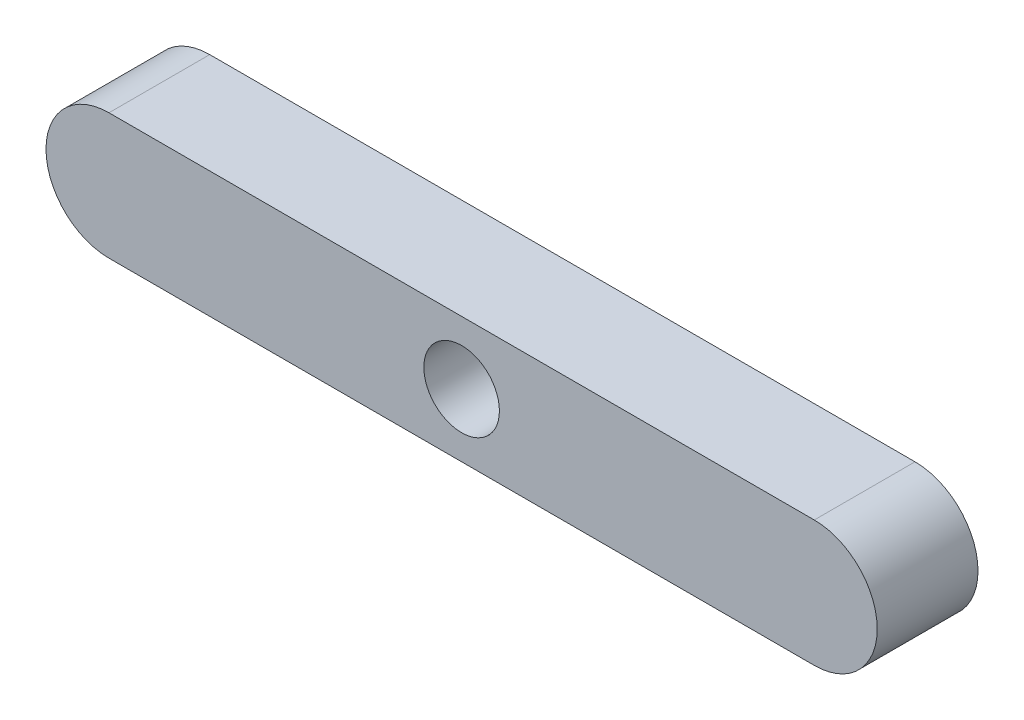
ISO-10303-21;
HEADER;
FILE_DESCRIPTION(('STEP AP214'),'2;1');
FILE_NAME('part.step','',(''),(''),'','','');
FILE_SCHEMA(('AUTOMOTIVE_DESIGN { 1 0 10303 214 1 1 1 1 }'));
ENDSEC;
DATA;
#1=APPLICATION_CONTEXT('core data for automotive mechanical design processes');
#2=APPLICATION_PROTOCOL_DEFINITION('international standard','automotive_design',2000,#1);
#3=PRODUCT_CONTEXT('',#1,'mechanical');
#4=PRODUCT('Part','Part','',(#3));
#5=PRODUCT_RELATED_PRODUCT_CATEGORY('part','',(#4));
#6=PRODUCT_DEFINITION_FORMATION('','',#4);
#7=PRODUCT_DEFINITION_CONTEXT('part definition',#1,'design');
#8=PRODUCT_DEFINITION('design','',#6,#7);
#9=PRODUCT_DEFINITION_SHAPE('','',#8);
#10=(LENGTH_UNIT() NAMED_UNIT(*) SI_UNIT(.MILLI.,.METRE.));
#11=(NAMED_UNIT(*) PLANE_ANGLE_UNIT() SI_UNIT($,.RADIAN.));
#12=(NAMED_UNIT(*) SI_UNIT($,.STERADIAN.) SOLID_ANGLE_UNIT());
#13=UNCERTAINTY_MEASURE_WITH_UNIT(LENGTH_MEASURE(1.E-05),#10,'distance_accuracy_value','');
#14=(GEOMETRIC_REPRESENTATION_CONTEXT(3) GLOBAL_UNCERTAINTY_ASSIGNED_CONTEXT((#13)) GLOBAL_UNIT_ASSIGNED_CONTEXT((#10,
#11,#12)) REPRESENTATION_CONTEXT('',''));
#15=CARTESIAN_POINT('',(0.,0.,0.));
#16=DIRECTION('',(0.,0.,1.));
#17=DIRECTION('',(1.,0.,0.));
#18=AXIS2_PLACEMENT_3D('',#15,#16,#17);
#19=CARTESIAN_POINT('',(0.,-2.5,2.));
#20=DIRECTION('',(0.,1.,0.));
#21=DIRECTION('',(-1.,0.,0.));
#22=AXIS2_PLACEMENT_3D('',#19,#20,#21);
#23=PLANE('',#22);
#24=DIRECTION('',(1.,0.,0.));
#25=VECTOR('',#24,1.);
#26=CARTESIAN_POINT('',(0.,-2.5,0.));
#27=LINE('',#26,#25);
#28=CARTESIAN_POINT('',(-7.,-2.5,0.));
#29=VERTEX_POINT('',#28);
#30=CARTESIAN_POINT('',(7.,-2.5,0.));
#31=VERTEX_POINT('',#30);
#32=EDGE_CURVE('E117',#29,#31,#27,.T.);
#33=ORIENTED_EDGE('',*,*,#32,.T.);
#34=DIRECTION('',(0.,0.,-1.));
#35=VECTOR('',#34,1.);
#36=CARTESIAN_POINT('',(7.,-2.5,2.));
#37=LINE('',#36,#35);
#38=CARTESIAN_POINT('',(7.,-2.5,2.));
#39=VERTEX_POINT('',#38);
#40=EDGE_CURVE('E11',#39,#31,#37,.T.);
#41=ORIENTED_EDGE('',*,*,#40,.F.);
#42=DIRECTION('',(1.,0.,0.));
#43=VECTOR('',#42,1.);
#44=CARTESIAN_POINT('',(0.,-2.5,2.));
#45=LINE('',#44,#43);
#46=CARTESIAN_POINT('',(-7.,-2.5,2.));
#47=VERTEX_POINT('',#46);
#48=EDGE_CURVE('E90',#47,#39,#45,.T.);
#49=ORIENTED_EDGE('',*,*,#48,.F.);
#50=DIRECTION('',(0.,0.,-1.));
#51=VECTOR('',#50,1.);
#52=CARTESIAN_POINT('',(-7.,-2.5,2.));
#53=LINE('',#52,#51);
#54=EDGE_CURVE('E116',#47,#29,#53,.T.);
#55=ORIENTED_EDGE('',*,*,#54,.T.);
#56=EDGE_LOOP('',(#33,#41,#49,#55));
#57=FACE_BOUND('',#56,.T.);
#58=ADVANCED_FACE('F47',(#57),#23,.F.);
#59=CARTESIAN_POINT('',(7.,-1.25,2.));
#60=DIRECTION('',(0.,0.,-1.));
#61=DIRECTION('',(-1.,0.,0.));
#62=AXIS2_PLACEMENT_3D('',#59,#60,#61);
#63=CYLINDRICAL_SURFACE('',#62,1.25);
#64=CARTESIAN_POINT('',(7.,-1.25,0.));
#65=DIRECTION('',(0.,0.,1.));
#66=DIRECTION('',(1.,0.,0.));
#67=AXIS2_PLACEMENT_3D('',#64,#65,#66);
#68=CIRCLE('',#67,1.25);
#69=CARTESIAN_POINT('',(7.,0.,0.));
#70=VERTEX_POINT('',#69);
#71=EDGE_CURVE('E100',#70,#31,#68,.F.);
#72=ORIENTED_EDGE('',*,*,#71,.F.);
#73=DIRECTION('',(0.,0.,-1.));
#74=VECTOR('',#73,1.);
#75=CARTESIAN_POINT('',(7.,0.,2.));
#76=LINE('',#75,#74);
#77=CARTESIAN_POINT('',(7.,0.,2.));
#78=VERTEX_POINT('',#77);
#79=EDGE_CURVE('E56',#78,#70,#76,.T.);
#80=ORIENTED_EDGE('',*,*,#79,.F.);
#81=CARTESIAN_POINT('',(7.,-1.25,2.));
#82=DIRECTION('',(0.,0.,1.));
#83=DIRECTION('',(1.,0.,0.));
#84=AXIS2_PLACEMENT_3D('',#81,#82,#83);
#85=CIRCLE('',#84,1.25);
#86=EDGE_CURVE('E98',#78,#39,#85,.F.);
#87=ORIENTED_EDGE('',*,*,#86,.T.);
#88=ORIENTED_EDGE('',*,*,#40,.T.);
#89=EDGE_LOOP('',(#72,#80,#87,#88));
#90=FACE_BOUND('',#89,.T.);
#91=ADVANCED_FACE('F97',(#90),#63,.T.);
#92=CARTESIAN_POINT('',(0.,0.,2.));
#93=DIRECTION('',(0.,-1.,0.));
#94=DIRECTION('',(1.,0.,0.));
#95=AXIS2_PLACEMENT_3D('',#92,#93,#94);
#96=PLANE('',#95);
#97=DIRECTION('',(-1.,0.,0.));
#98=VECTOR('',#97,1.);
#99=CARTESIAN_POINT('',(0.,0.,0.));
#100=LINE('',#99,#98);
#101=CARTESIAN_POINT('',(-7.,0.,0.));
#102=VERTEX_POINT('',#101);
#103=EDGE_CURVE('E79',#70,#102,#100,.T.);
#104=ORIENTED_EDGE('',*,*,#103,.T.);
#105=DIRECTION('',(0.,0.,-1.));
#106=VECTOR('',#105,1.);
#107=CARTESIAN_POINT('',(-7.,0.,2.));
#108=LINE('',#107,#106);
#109=CARTESIAN_POINT('',(-7.,0.,2.));
#110=VERTEX_POINT('',#109);
#111=EDGE_CURVE('E102',#110,#102,#108,.T.);
#112=ORIENTED_EDGE('',*,*,#111,.F.);
#113=DIRECTION('',(-1.,0.,0.));
#114=VECTOR('',#113,1.);
#115=CARTESIAN_POINT('',(0.,0.,2.));
#116=LINE('',#115,#114);
#117=EDGE_CURVE('E103',#78,#110,#116,.T.);
#118=ORIENTED_EDGE('',*,*,#117,.F.);
#119=ORIENTED_EDGE('',*,*,#79,.T.);
#120=EDGE_LOOP('',(#104,#112,#118,#119));
#121=FACE_BOUND('',#120,.T.);
#122=ADVANCED_FACE('F104',(#121),#96,.F.);
#123=CARTESIAN_POINT('',(-7.,-1.25,2.));
#124=DIRECTION('',(0.,0.,-1.));
#125=DIRECTION('',(-1.,0.,0.));
#126=AXIS2_PLACEMENT_3D('',#123,#124,#125);
#127=CYLINDRICAL_SURFACE('',#126,1.25);
#128=CARTESIAN_POINT('',(-7.,-1.25,0.));
#129=DIRECTION('',(0.,0.,1.));
#130=DIRECTION('',(1.,0.,0.));
#131=AXIS2_PLACEMENT_3D('',#128,#129,#130);
#132=CIRCLE('',#131,1.25);
#133=EDGE_CURVE('E85',#102,#29,#132,.T.);
#134=ORIENTED_EDGE('',*,*,#133,.T.);
#135=ORIENTED_EDGE('',*,*,#54,.F.);
#136=CARTESIAN_POINT('',(-7.,-1.25,2.));
#137=DIRECTION('',(0.,0.,1.));
#138=DIRECTION('',(1.,0.,0.));
#139=AXIS2_PLACEMENT_3D('',#136,#137,#138);
#140=CIRCLE('',#139,1.25);
#141=EDGE_CURVE('E64',#110,#47,#140,.T.);
#142=ORIENTED_EDGE('',*,*,#141,.F.);
#143=ORIENTED_EDGE('',*,*,#111,.T.);
#144=EDGE_LOOP('',(#134,#135,#142,#143));
#145=FACE_BOUND('',#144,.T.);
#146=ADVANCED_FACE('F131',(#145),#127,.T.);
#147=CARTESIAN_POINT('',(0.,0.,2.));
#148=DIRECTION('',(0.,0.,1.));
#149=DIRECTION('',(1.,0.,0.));
#150=AXIS2_PLACEMENT_3D('',#147,#148,#149);
#151=PLANE('',#150);
#152=CARTESIAN_POINT('',(0.,-1.25,2.));
#153=DIRECTION('',(0.,0.,1.));
#154=DIRECTION('',(1.,0.,0.));
#155=AXIS2_PLACEMENT_3D('',#152,#153,#154);
#156=CIRCLE('',#155,0.75);
#157=CARTESIAN_POINT('',(0.75,-1.25,2.));
#158=VERTEX_POINT('',#157);
#159=EDGE_CURVE('E163',#158,#158,#156,.T.);
#160=ORIENTED_EDGE('',*,*,#159,.F.);
#161=EDGE_LOOP('',(#160));
#162=FACE_BOUND('',#161,.T.);
#163=ORIENTED_EDGE('',*,*,#48,.T.);
#164=ORIENTED_EDGE('',*,*,#86,.F.);
#165=ORIENTED_EDGE('',*,*,#117,.T.);
#166=ORIENTED_EDGE('',*,*,#141,.T.);
#167=EDGE_LOOP('',(#163,#164,#165,#166));
#168=FACE_BOUND('',#167,.T.);
#169=ADVANCED_FACE('F107',(#162,#168),#151,.T.);
#170=CARTESIAN_POINT('',(0.,0.,0.));
#171=DIRECTION('',(0.,0.,1.));
#172=DIRECTION('',(1.,0.,0.));
#173=AXIS2_PLACEMENT_3D('',#170,#171,#172);
#174=PLANE('',#173);
#175=CARTESIAN_POINT('',(0.,-1.25,0.));
#176=DIRECTION('',(0.,0.,1.));
#177=DIRECTION('',(1.,0.,0.));
#178=AXIS2_PLACEMENT_3D('',#175,#176,#177);
#179=CIRCLE('',#178,0.75);
#180=CARTESIAN_POINT('',(0.75,-1.25,0.));
#181=VERTEX_POINT('',#180);
#182=EDGE_CURVE('E121',#181,#181,#179,.T.);
#183=ORIENTED_EDGE('',*,*,#182,.T.);
#184=EDGE_LOOP('',(#183));
#185=FACE_BOUND('',#184,.T.);
#186=ORIENTED_EDGE('',*,*,#32,.F.);
#187=ORIENTED_EDGE('',*,*,#133,.F.);
#188=ORIENTED_EDGE('',*,*,#103,.F.);
#189=ORIENTED_EDGE('',*,*,#71,.T.);
#190=EDGE_LOOP('',(#186,#187,#188,#189));
#191=FACE_BOUND('',#190,.T.);
#192=ADVANCED_FACE('F134',(#185,#191),#174,.F.);
#193=CARTESIAN_POINT('',(0.,-1.25,0.));
#194=DIRECTION('',(0.,0.,1.));
#195=DIRECTION('',(1.,0.,0.));
#196=AXIS2_PLACEMENT_3D('',#193,#194,#195);
#197=CYLINDRICAL_SURFACE('',#196,0.75);
#198=ORIENTED_EDGE('',*,*,#182,.F.);
#199=EDGE_LOOP('',(#198));
#200=FACE_BOUND('',#199,.T.);
#201=ORIENTED_EDGE('',*,*,#159,.T.);
#202=EDGE_LOOP('',(#201));
#203=FACE_BOUND('',#202,.T.);
#204=ADVANCED_FACE('F149',(#200,#203),#197,.F.);
#205=CLOSED_SHELL('',(#58,#91,#122,#146,#169,#192,#204));
#206=MANIFOLD_SOLID_BREP('B2',#205);
#207=ADVANCED_BREP_SHAPE_REPRESENTATION('',(#18,#206),#14);
#208=SHAPE_DEFINITION_REPRESENTATION(#9,#207);
ENDSEC;
END-ISO-10303-21;
